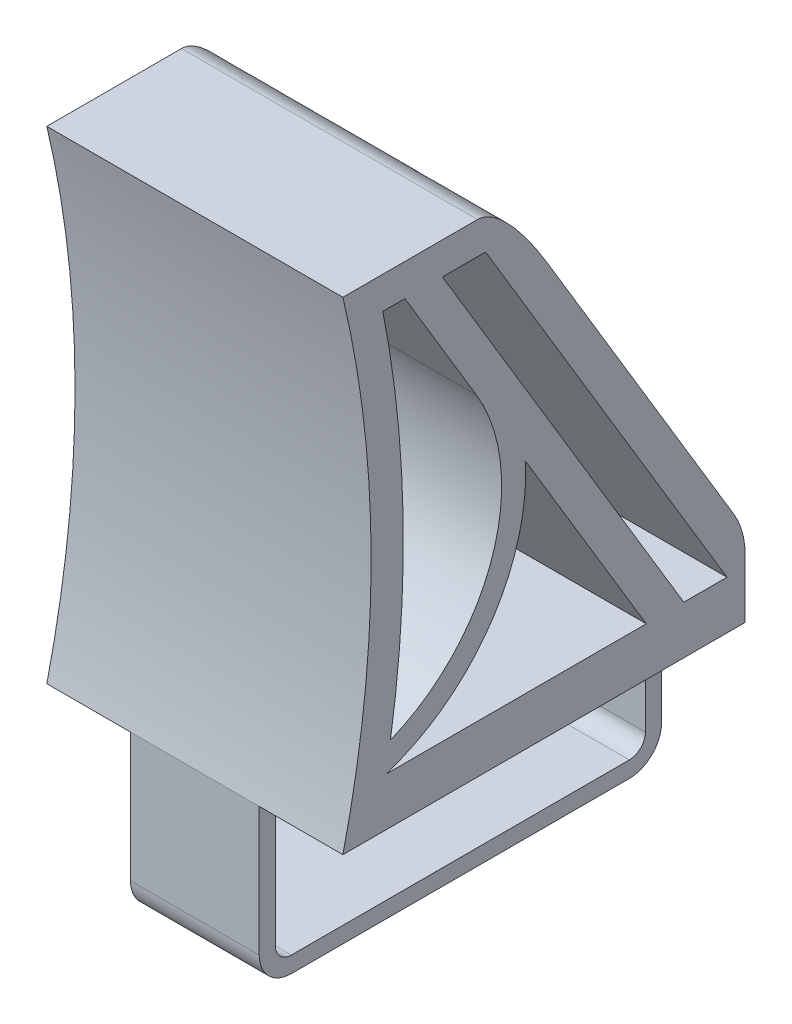
ISO-10303-21;
HEADER;
FILE_DESCRIPTION(('STEP AP214'),'2;1');
FILE_NAME('part.step','',(''),(''),'','','');
FILE_SCHEMA(('AUTOMOTIVE_DESIGN { 1 0 10303 214 1 1 1 1 }'));
ENDSEC;
DATA;
#1=APPLICATION_CONTEXT('core data for automotive mechanical design processes');
#2=APPLICATION_PROTOCOL_DEFINITION('international standard','automotive_design',2000,#1);
#3=PRODUCT_CONTEXT('',#1,'mechanical');
#4=PRODUCT('Part','Part','',(#3));
#5=PRODUCT_RELATED_PRODUCT_CATEGORY('part','',(#4));
#6=PRODUCT_DEFINITION_FORMATION('','',#4);
#7=PRODUCT_DEFINITION_CONTEXT('part definition',#1,'design');
#8=PRODUCT_DEFINITION('design','',#6,#7);
#9=PRODUCT_DEFINITION_SHAPE('','',#8);
#10=(LENGTH_UNIT() NAMED_UNIT(*) SI_UNIT(.MILLI.,.METRE.));
#11=(NAMED_UNIT(*) PLANE_ANGLE_UNIT() SI_UNIT($,.RADIAN.));
#12=(NAMED_UNIT(*) SI_UNIT($,.STERADIAN.) SOLID_ANGLE_UNIT());
#13=UNCERTAINTY_MEASURE_WITH_UNIT(LENGTH_MEASURE(1.E-05),#10,'distance_accuracy_value','');
#14=(GEOMETRIC_REPRESENTATION_CONTEXT(3) GLOBAL_UNCERTAINTY_ASSIGNED_CONTEXT((#13)) GLOBAL_UNIT_ASSIGNED_CONTEXT((#10,
#11,#12)) REPRESENTATION_CONTEXT('',''));
#15=CARTESIAN_POINT('',(0.,0.,0.));
#16=DIRECTION('',(0.,0.,1.));
#17=DIRECTION('',(1.,0.,0.));
#18=AXIS2_PLACEMENT_3D('',#15,#16,#17);
#19=CARTESIAN_POINT('',(5.2,0.,0.));
#20=DIRECTION('',(-1.,0.,0.));
#21=DIRECTION('',(0.,0.,-1.));
#22=AXIS2_PLACEMENT_3D('',#19,#20,#21);
#23=PLANE('',#22);
#24=DIRECTION('',(0.,0.,1.));
#25=VECTOR('',#24,1.);
#26=CARTESIAN_POINT('',(5.2,0.,0.));
#27=LINE('',#26,#25);
#28=CARTESIAN_POINT('',(5.20000000000001,0.,-25.));
#29=VERTEX_POINT('',#28);
#30=CARTESIAN_POINT('',(5.2,0.,0.));
#31=VERTEX_POINT('',#30);
#32=EDGE_CURVE('E718',#29,#31,#27,.T.);
#33=ORIENTED_EDGE('',*,*,#32,.F.);
#34=DIRECTION('',(0.,1.,0.));
#35=VECTOR('',#34,1.);
#36=CARTESIAN_POINT('',(5.20000000000001,0.,-25.));
#37=LINE('',#36,#35);
#38=CARTESIAN_POINT('',(5.20000000000001,-8.,-25.));
#39=VERTEX_POINT('',#38);
#40=EDGE_CURVE('E725',#39,#29,#37,.T.);
#41=ORIENTED_EDGE('',*,*,#40,.F.);
#42=CARTESIAN_POINT('',(5.20000000000001,-8.,-23.));
#43=DIRECTION('',(1.,0.,0.));
#44=DIRECTION('',(0.,0.,-1.));
#45=AXIS2_PLACEMENT_3D('',#42,#43,#44);
#46=CIRCLE('',#45,2.);
#47=CARTESIAN_POINT('',(5.20000000000001,-10.,-23.));
#48=VERTEX_POINT('',#47);
#49=EDGE_CURVE('E729',#48,#39,#46,.T.);
#50=ORIENTED_EDGE('',*,*,#49,.F.);
#51=DIRECTION('',(0.,0.,-1.));
#52=VECTOR('',#51,1.);
#53=CARTESIAN_POINT('',(5.2,-10.,0.));
#54=LINE('',#53,#52);
#55=CARTESIAN_POINT('',(5.2,-10.,-2.));
#56=VERTEX_POINT('',#55);
#57=EDGE_CURVE('E735',#56,#48,#54,.T.);
#58=ORIENTED_EDGE('',*,*,#57,.F.);
#59=CARTESIAN_POINT('',(5.2,-8.,-2.));
#60=DIRECTION('',(1.,0.,0.));
#61=DIRECTION('',(0.,0.,-1.));
#62=AXIS2_PLACEMENT_3D('',#59,#60,#61);
#63=CIRCLE('',#62,2.);
#64=CARTESIAN_POINT('',(5.2,-8.,0.));
#65=VERTEX_POINT('',#64);
#66=EDGE_CURVE('E720',#65,#56,#63,.T.);
#67=ORIENTED_EDGE('',*,*,#66,.F.);
#68=DIRECTION('',(0.,-1.,0.));
#69=VECTOR('',#68,1.);
#70=CARTESIAN_POINT('',(5.2,0.,0.));
#71=LINE('',#70,#69);
#72=EDGE_CURVE('E318',#31,#65,#71,.T.);
#73=ORIENTED_EDGE('',*,*,#72,.F.);
#74=EDGE_LOOP('',(#33,#41,#50,#58,#67,#73));
#75=FACE_BOUND('',#74,.T.);
#76=DIRECTION('',(0.,1.,0.));
#77=VECTOR('',#76,1.);
#78=CARTESIAN_POINT('',(5.20000000000001,0.,-24.));
#79=LINE('',#78,#77);
#80=CARTESIAN_POINT('',(5.20000000000001,-8.,-24.));
#81=VERTEX_POINT('',#80);
#82=CARTESIAN_POINT('',(5.20000000000001,-1.,-24.));
#83=VERTEX_POINT('',#82);
#84=EDGE_CURVE('E267',#81,#83,#79,.T.);
#85=ORIENTED_EDGE('',*,*,#84,.T.);
#86=DIRECTION('',(0.,0.,1.));
#87=VECTOR('',#86,1.);
#88=CARTESIAN_POINT('',(5.2,-1.,0.));
#89=LINE('',#88,#87);
#90=CARTESIAN_POINT('',(5.2,-1.,-0.999999999999996));
#91=VERTEX_POINT('',#90);
#92=EDGE_CURVE('E12',#83,#91,#89,.T.);
#93=ORIENTED_EDGE('',*,*,#92,.T.);
#94=DIRECTION('',(0.,-1.,0.));
#95=VECTOR('',#94,1.);
#96=CARTESIAN_POINT('',(5.2,0.,-0.999999999999996));
#97=LINE('',#96,#95);
#98=CARTESIAN_POINT('',(5.2,-8.,-0.999999999999996));
#99=VERTEX_POINT('',#98);
#100=EDGE_CURVE('E64',#91,#99,#97,.T.);
#101=ORIENTED_EDGE('',*,*,#100,.T.);
#102=CARTESIAN_POINT('',(5.2,-8.,-2.));
#103=DIRECTION('',(-1.,0.,0.));
#104=DIRECTION('',(0.,0.,1.));
#105=AXIS2_PLACEMENT_3D('',#102,#103,#104);
#106=CIRCLE('',#105,1.);
#107=CARTESIAN_POINT('',(5.20000000000001,-9.,-2.));
#108=VERTEX_POINT('',#107);
#109=EDGE_CURVE('E282',#99,#108,#106,.F.);
#110=ORIENTED_EDGE('',*,*,#109,.T.);
#111=DIRECTION('',(0.,0.,-1.));
#112=VECTOR('',#111,1.);
#113=CARTESIAN_POINT('',(5.2,-9.,0.));
#114=LINE('',#113,#112);
#115=CARTESIAN_POINT('',(5.20000000000001,-9.,-23.));
#116=VERTEX_POINT('',#115);
#117=EDGE_CURVE('E275',#108,#116,#114,.T.);
#118=ORIENTED_EDGE('',*,*,#117,.T.);
#119=CARTESIAN_POINT('',(5.20000000000001,-8.,-23.));
#120=DIRECTION('',(-1.,0.,0.));
#121=DIRECTION('',(0.,0.,1.));
#122=AXIS2_PLACEMENT_3D('',#119,#120,#121);
#123=CIRCLE('',#122,1.);
#124=EDGE_CURVE('E258',#116,#81,#123,.F.);
#125=ORIENTED_EDGE('',*,*,#124,.T.);
#126=EDGE_LOOP('',(#85,#93,#101,#110,#118,#125));
#127=FACE_BOUND('',#126,.T.);
#128=ADVANCED_FACE('F55',(#75,#127),#23,.T.);
#129=CARTESIAN_POINT('',(3.19999999999999,-10.,0.));
#130=DIRECTION('',(0.,0.,-1.));
#131=DIRECTION('',(-1.,0.,0.));
#132=AXIS2_PLACEMENT_3D('',#129,#130,#131);
#133=PLANE('',#132);
#134=ORIENTED_EDGE('',*,*,#72,.T.);
#135=DIRECTION('',(-1.,0.,0.));
#136=VECTOR('',#135,1.);
#137=CARTESIAN_POINT('',(15.2,-8.,0.));
#138=LINE('',#137,#136);
#139=CARTESIAN_POINT('',(13.2,-8.,0.));
#140=VERTEX_POINT('',#139);
#141=EDGE_CURVE('E673',#65,#140,#138,.F.);
#142=ORIENTED_EDGE('',*,*,#141,.T.);
#143=DIRECTION('',(0.,-1.,0.));
#144=VECTOR('',#143,1.);
#145=CARTESIAN_POINT('',(13.2,0.,0.));
#146=LINE('',#145,#144);
#147=CARTESIAN_POINT('',(13.2,0.,0.));
#148=VERTEX_POINT('',#147);
#149=EDGE_CURVE('E323',#148,#140,#146,.T.);
#150=ORIENTED_EDGE('',*,*,#149,.F.);
#151=DIRECTION('',(-1.,0.,0.));
#152=VECTOR('',#151,1.);
#153=CARTESIAN_POINT('',(3.19999999999999,0.,0.));
#154=LINE('',#153,#152);
#155=EDGE_CURVE('E340',#148,#31,#154,.T.);
#156=ORIENTED_EDGE('',*,*,#155,.T.);
#157=EDGE_LOOP('',(#134,#142,#150,#156));
#158=FACE_BOUND('',#157,.T.);
#159=ADVANCED_FACE('F706',(#158),#133,.F.);
#160=CARTESIAN_POINT('',(0.,-10.,0.));
#161=DIRECTION('',(0.,-1.,0.));
#162=DIRECTION('',(0.,0.,-1.));
#163=AXIS2_PLACEMENT_3D('',#160,#161,#162);
#164=PLANE('',#163);
#165=DIRECTION('',(-1.,0.,0.));
#166=VECTOR('',#165,1.);
#167=CARTESIAN_POINT('',(3.19999999999999,-10.,-2.));
#168=LINE('',#167,#166);
#169=CARTESIAN_POINT('',(13.2,-10.,-2.));
#170=VERTEX_POINT('',#169);
#171=EDGE_CURVE('E669',#170,#56,#168,.T.);
#172=ORIENTED_EDGE('',*,*,#171,.T.);
#173=ORIENTED_EDGE('',*,*,#57,.T.);
#174=DIRECTION('',(1.,0.,0.));
#175=VECTOR('',#174,1.);
#176=CARTESIAN_POINT('',(15.2,-10.,-23.));
#177=LINE('',#176,#175);
#178=CARTESIAN_POINT('',(13.2,-10.,-23.));
#179=VERTEX_POINT('',#178);
#180=EDGE_CURVE('E661',#48,#179,#177,.T.);
#181=ORIENTED_EDGE('',*,*,#180,.T.);
#182=DIRECTION('',(0.,0.,-1.));
#183=VECTOR('',#182,1.);
#184=CARTESIAN_POINT('',(13.2,-10.,0.));
#185=LINE('',#184,#183);
#186=EDGE_CURVE('E330',#170,#179,#185,.T.);
#187=ORIENTED_EDGE('',*,*,#186,.F.);
#188=EDGE_LOOP('',(#172,#173,#181,#187));
#189=FACE_BOUND('',#188,.T.);
#190=ADVANCED_FACE('F857',(#189),#164,.T.);
#191=CARTESIAN_POINT('',(0.,-8.,-2.));
#192=DIRECTION('',(1.,0.,0.));
#193=DIRECTION('',(0.,0.,-1.));
#194=AXIS2_PLACEMENT_3D('',#191,#192,#193);
#195=CYLINDRICAL_SURFACE('',#194,2.);
#196=ORIENTED_EDGE('',*,*,#141,.F.);
#197=ORIENTED_EDGE('',*,*,#66,.T.);
#198=ORIENTED_EDGE('',*,*,#171,.F.);
#199=CARTESIAN_POINT('',(13.2,-8.,-2.));
#200=DIRECTION('',(1.,0.,0.));
#201=DIRECTION('',(0.,0.,-1.));
#202=AXIS2_PLACEMENT_3D('',#199,#200,#201);
#203=CIRCLE('',#202,2.);
#204=EDGE_CURVE('E327',#140,#170,#203,.T.);
#205=ORIENTED_EDGE('',*,*,#204,.F.);
#206=EDGE_LOOP('',(#196,#197,#198,#205));
#207=FACE_BOUND('',#206,.T.);
#208=ADVANCED_FACE('F873',(#207),#195,.T.);
#209=CARTESIAN_POINT('',(0.,-8.,-23.));
#210=DIRECTION('',(-1.,0.,0.));
#211=DIRECTION('',(0.,0.,1.));
#212=AXIS2_PLACEMENT_3D('',#209,#210,#211);
#213=CYLINDRICAL_SURFACE('',#212,2.);
#214=ORIENTED_EDGE('',*,*,#180,.F.);
#215=ORIENTED_EDGE('',*,*,#49,.T.);
#216=DIRECTION('',(1.,0.,0.));
#217=VECTOR('',#216,1.);
#218=CARTESIAN_POINT('',(3.20000000000001,-8.,-25.));
#219=LINE('',#218,#217);
#220=CARTESIAN_POINT('',(13.2,-8.,-25.));
#221=VERTEX_POINT('',#220);
#222=EDGE_CURVE('E676',#221,#39,#219,.F.);
#223=ORIENTED_EDGE('',*,*,#222,.F.);
#224=CARTESIAN_POINT('',(13.2,-8.,-23.));
#225=DIRECTION('',(1.,0.,0.));
#226=DIRECTION('',(0.,0.,-1.));
#227=AXIS2_PLACEMENT_3D('',#224,#225,#226);
#228=CIRCLE('',#227,2.);
#229=EDGE_CURVE('E333',#179,#221,#228,.T.);
#230=ORIENTED_EDGE('',*,*,#229,.F.);
#231=EDGE_LOOP('',(#214,#215,#223,#230));
#232=FACE_BOUND('',#231,.T.);
#233=ADVANCED_FACE('F57',(#232),#213,.T.);
#234=CARTESIAN_POINT('',(18.4,0.,-25.));
#235=DIRECTION('',(0.,0.,1.));
#236=DIRECTION('',(1.,0.,0.));
#237=AXIS2_PLACEMENT_3D('',#234,#235,#236);
#238=PLANE('',#237);
#239=ORIENTED_EDGE('',*,*,#40,.T.);
#240=DIRECTION('',(-1.,0.,0.));
#241=VECTOR('',#240,1.);
#242=CARTESIAN_POINT('',(18.4,0.,-25.));
#243=LINE('',#242,#241);
#244=CARTESIAN_POINT('',(0.,0.,-25.));
#245=VERTEX_POINT('',#244);
#246=EDGE_CURVE('E534',#29,#245,#243,.T.);
#247=ORIENTED_EDGE('',*,*,#246,.T.);
#248=DIRECTION('',(0.,1.,0.));
#249=VECTOR('',#248,1.);
#250=CARTESIAN_POINT('',(0.,0.,-25.));
#251=LINE('',#250,#249);
#252=CARTESIAN_POINT('',(0.,3.61508017525783,-25.));
#253=VERTEX_POINT('',#252);
#254=EDGE_CURVE('E522',#245,#253,#251,.T.);
#255=ORIENTED_EDGE('',*,*,#254,.T.);
#256=DIRECTION('',(-1.,0.,0.));
#257=VECTOR('',#256,1.);
#258=CARTESIAN_POINT('',(18.4,3.61508017525783,-25.));
#259=LINE('',#258,#257);
#260=CARTESIAN_POINT('',(18.4,3.61508017525783,-25.));
#261=VERTEX_POINT('',#260);
#262=EDGE_CURVE('E647',#253,#261,#259,.F.);
#263=ORIENTED_EDGE('',*,*,#262,.T.);
#264=DIRECTION('',(0.,1.,0.));
#265=VECTOR('',#264,1.);
#266=CARTESIAN_POINT('',(18.4,0.,-25.));
#267=LINE('',#266,#265);
#268=CARTESIAN_POINT('',(18.4,0.,-25.));
#269=VERTEX_POINT('',#268);
#270=EDGE_CURVE('E808',#269,#261,#267,.T.);
#271=ORIENTED_EDGE('',*,*,#270,.F.);
#272=CARTESIAN_POINT('',(13.2,0.,-25.));
#273=VERTEX_POINT('',#272);
#274=EDGE_CURVE('E530',#269,#273,#243,.T.);
#275=ORIENTED_EDGE('',*,*,#274,.T.);
#276=DIRECTION('',(0.,1.,0.));
#277=VECTOR('',#276,1.);
#278=CARTESIAN_POINT('',(13.2,0.,-25.));
#279=LINE('',#278,#277);
#280=EDGE_CURVE('E336',#221,#273,#279,.T.);
#281=ORIENTED_EDGE('',*,*,#280,.F.);
#282=ORIENTED_EDGE('',*,*,#222,.T.);
#283=EDGE_LOOP('',(#239,#247,#255,#263,#271,#275,#281,#282));
#284=FACE_BOUND('',#283,.T.);
#285=ADVANCED_FACE('F645',(#284),#238,.F.);
#286=CARTESIAN_POINT('',(18.4,0.,0.));
#287=DIRECTION('',(0.,1.,0.));
#288=DIRECTION('',(0.,0.,1.));
#289=AXIS2_PLACEMENT_3D('',#286,#287,#288);
#290=PLANE('',#289);
#291=ORIENTED_EDGE('',*,*,#246,.F.);
#292=ORIENTED_EDGE('',*,*,#32,.T.);
#293=DIRECTION('',(-1.,0.,0.));
#294=VECTOR('',#293,1.);
#295=CARTESIAN_POINT('',(18.4,0.,0.));
#296=LINE('',#295,#294);
#297=CARTESIAN_POINT('',(0.,0.,0.));
#298=VERTEX_POINT('',#297);
#299=EDGE_CURVE('E533',#31,#298,#296,.T.);
#300=ORIENTED_EDGE('',*,*,#299,.T.);
#301=DIRECTION('',(0.,0.,-1.));
#302=VECTOR('',#301,1.);
#303=CARTESIAN_POINT('',(0.,0.,0.));
#304=LINE('',#303,#302);
#305=EDGE_CURVE('E632',#298,#245,#304,.T.);
#306=ORIENTED_EDGE('',*,*,#305,.T.);
#307=EDGE_LOOP('',(#291,#292,#300,#306));
#308=FACE_BOUND('',#307,.T.);
#309=ADVANCED_FACE('F723',(#308),#290,.F.);
#310=CARTESIAN_POINT('',(18.4,0.,0.));
#311=VERTEX_POINT('',#310);
#312=EDGE_CURVE('E535',#311,#148,#296,.T.);
#313=ORIENTED_EDGE('',*,*,#312,.T.);
#314=DIRECTION('',(0.,0.,1.));
#315=VECTOR('',#314,1.);
#316=CARTESIAN_POINT('',(13.2,0.,0.));
#317=LINE('',#316,#315);
#318=EDGE_CURVE('E319',#273,#148,#317,.T.);
#319=ORIENTED_EDGE('',*,*,#318,.F.);
#320=ORIENTED_EDGE('',*,*,#274,.F.);
#321=DIRECTION('',(0.,0.,-1.));
#322=VECTOR('',#321,1.);
#323=CARTESIAN_POINT('',(18.4,0.,0.));
#324=LINE('',#323,#322);
#325=EDGE_CURVE('E817',#311,#269,#324,.T.);
#326=ORIENTED_EDGE('',*,*,#325,.F.);
#327=EDGE_LOOP('',(#313,#319,#320,#326));
#328=FACE_BOUND('',#327,.T.);
#329=ADVANCED_FACE('F418',(#328),#290,.F.);
#330=CARTESIAN_POINT('',(18.4,30.,0.));
#331=DIRECTION('',(0.,-1.,0.));
#332=DIRECTION('',(0.,0.,-1.));
#333=AXIS2_PLACEMENT_3D('',#330,#331,#332);
#334=PLANE('',#333);
#335=DIRECTION('',(0.,0.,1.));
#336=VECTOR('',#335,1.);
#337=CARTESIAN_POINT('',(18.4,30.,0.));
#338=LINE('',#337,#336);
#339=CARTESIAN_POINT('',(18.4,30.,-8.36904810515469));
#340=VERTEX_POINT('',#339);
#341=CARTESIAN_POINT('',(18.4,30.,0.));
#342=VERTEX_POINT('',#341);
#343=EDGE_CURVE('E382',#340,#342,#338,.T.);
#344=ORIENTED_EDGE('',*,*,#343,.F.);
#345=CARTESIAN_POINT('',(-0.920000000000004,30.,-8.36904810515469));
#346=CARTESIAN_POINT('',(5.82666666666666,30.,-8.36904810515469));
#347=CARTESIAN_POINT('',(12.5733333333333,30.,-8.36904810515469));
#348=CARTESIAN_POINT('',(19.32,30.,-8.36904810515469));
#349=(BOUNDED_CURVE() B_SPLINE_CURVE(3,(#345,#346,#347,#348),.UNSPECIFIED.,.F.,
.F.) B_SPLINE_CURVE_WITH_KNOTS((4,4),(-0.000920000000000001,0.01932),
.UNSPECIFIED.) CURVE() GEOMETRIC_REPRESENTATION_ITEM() RATIONAL_B_SPLINE_CURVE((1.,1.,1.,1.)) REPRESENTATION_ITEM(''));
#350=CARTESIAN_POINT('',(0.,30.,-8.36904810515469));
#351=VERTEX_POINT('',#350);
#352=EDGE_CURVE('E399',#340,#351,#349,.F.);
#353=ORIENTED_EDGE('',*,*,#352,.T.);
#354=DIRECTION('',(0.,0.,1.));
#355=VECTOR('',#354,1.);
#356=CARTESIAN_POINT('',(0.,30.,0.));
#357=LINE('',#356,#355);
#358=CARTESIAN_POINT('',(0.,30.,0.));
#359=VERTEX_POINT('',#358);
#360=EDGE_CURVE('E391',#351,#359,#357,.T.);
#361=ORIENTED_EDGE('',*,*,#360,.T.);
#362=DIRECTION('',(-1.,0.,0.));
#363=VECTOR('',#362,1.);
#364=CARTESIAN_POINT('',(18.4,30.,0.));
#365=LINE('',#364,#363);
#366=EDGE_CURVE('E538',#342,#359,#365,.T.);
#367=ORIENTED_EDGE('',*,*,#366,.F.);
#368=EDGE_LOOP('',(#344,#353,#361,#367));
#369=FACE_BOUND('',#368,.T.);
#370=ADVANCED_FACE('F407',(#369),#334,.F.);
#371=CARTESIAN_POINT('',(18.4,15.,63.2455532033676));
#372=DIRECTION('',(-1.,0.,0.));
#373=DIRECTION('',(0.,0.,1.));
#374=AXIS2_PLACEMENT_3D('',#371,#372,#373);
#375=CYLINDRICAL_SURFACE('',#374,65.);
#376=CARTESIAN_POINT('',(0.,15.,63.2455532033676));
#377=DIRECTION('',(1.,0.,0.));
#378=DIRECTION('',(0.,0.,-1.));
#379=AXIS2_PLACEMENT_3D('',#376,#377,#378);
#380=CIRCLE('',#379,65.);
#381=EDGE_CURVE('E629',#359,#298,#380,.F.);
#382=ORIENTED_EDGE('',*,*,#381,.T.);
#383=ORIENTED_EDGE('',*,*,#299,.F.);
#384=ORIENTED_EDGE('',*,*,#155,.F.);
#385=ORIENTED_EDGE('',*,*,#312,.F.);
#386=CARTESIAN_POINT('',(18.4,15.,63.2455532033676));
#387=DIRECTION('',(1.,0.,0.));
#388=DIRECTION('',(0.,0.,-1.));
#389=AXIS2_PLACEMENT_3D('',#386,#387,#388);
#390=CIRCLE('',#389,65.);
#391=EDGE_CURVE('E385',#342,#311,#390,.F.);
#392=ORIENTED_EDGE('',*,*,#391,.F.);
#393=ORIENTED_EDGE('',*,*,#366,.T.);
#394=EDGE_LOOP('',(#382,#383,#384,#385,#392,#393));
#395=FACE_BOUND('',#394,.T.);
#396=ADVANCED_FACE('F417',(#395),#375,.F.);
#397=CARTESIAN_POINT('',(18.4,2.99999999999999,0.));
#398=DIRECTION('',(0.,1.,0.));
#399=DIRECTION('',(0.,0.,1.));
#400=AXIS2_PLACEMENT_3D('',#397,#398,#399);
#401=PLANE('',#400);
#402=DIRECTION('',(0.,0.,-1.));
#403=VECTOR('',#402,1.);
#404=CARTESIAN_POINT('',(0.,2.99999999999999,0.));
#405=LINE('',#404,#403);
#406=CARTESIAN_POINT('',(0.,3.,-21.185381370433));
#407=VERTEX_POINT('',#406);
#408=CARTESIAN_POINT('',(0.,3.,-23.8676192420619));
#409=VERTEX_POINT('',#408);
#410=EDGE_CURVE('E612',#407,#409,#405,.T.);
#411=ORIENTED_EDGE('',*,*,#410,.F.);
#412=DIRECTION('',(-1.,0.,0.));
#413=VECTOR('',#412,1.);
#414=CARTESIAN_POINT('',(18.4,3.,-21.185381370433));
#415=LINE('',#414,#413);
#416=CARTESIAN_POINT('',(18.4,3.,-21.185381370433));
#417=VERTEX_POINT('',#416);
#418=EDGE_CURVE('E552',#417,#407,#415,.T.);
#419=ORIENTED_EDGE('',*,*,#418,.F.);
#420=DIRECTION('',(0.,0.,-1.));
#421=VECTOR('',#420,1.);
#422=CARTESIAN_POINT('',(18.4,2.99999999999999,0.));
#423=LINE('',#422,#421);
#424=CARTESIAN_POINT('',(18.4,3.,-23.8676192420619));
#425=VERTEX_POINT('',#424);
#426=EDGE_CURVE('E368',#417,#425,#423,.T.);
#427=ORIENTED_EDGE('',*,*,#426,.T.);
#428=DIRECTION('',(-1.,0.,0.));
#429=VECTOR('',#428,1.);
#430=CARTESIAN_POINT('',(18.4,3.,-23.8676192420619));
#431=LINE('',#430,#429);
#432=EDGE_CURVE('E542',#425,#409,#431,.T.);
#433=ORIENTED_EDGE('',*,*,#432,.T.);
#434=EDGE_LOOP('',(#411,#419,#427,#433));
#435=FACE_BOUND('',#434,.T.);
#436=ADVANCED_FACE('F434',(#435),#401,.T.);
#437=CARTESIAN_POINT('',(18.4,10.1406094281322,-16.9010157135537));
#438=DIRECTION('',(0.,-0.514495755427526,0.857492925712544));
#439=DIRECTION('',(0.,-0.857492925712544,-0.514495755427526));
#440=AXIS2_PLACEMENT_3D('',#437,#438,#439);
#441=PLANE('',#440);
#442=DIRECTION('',(0.,0.857492925712544,0.514495755427526));
#443=VECTOR('',#442,1.);
#444=CARTESIAN_POINT('',(0.,10.1406094281322,-16.9010157135537));
#445=LINE('',#444,#443);
#446=CARTESIAN_POINT('',(0.,28.,-6.18538137043304));
#447=VERTEX_POINT('',#446);
#448=EDGE_CURVE('E616',#407,#447,#445,.T.);
#449=ORIENTED_EDGE('',*,*,#448,.T.);
#450=DIRECTION('',(-1.,0.,0.));
#451=VECTOR('',#450,1.);
#452=CARTESIAN_POINT('',(18.4,28.,-6.18538137043304));
#453=LINE('',#452,#451);
#454=CARTESIAN_POINT('',(18.4,28.,-6.18538137043304));
#455=VERTEX_POINT('',#454);
#456=EDGE_CURVE('E549',#455,#447,#453,.T.);
#457=ORIENTED_EDGE('',*,*,#456,.F.);
#458=DIRECTION('',(0.,0.857492925712544,0.514495755427526));
#459=VECTOR('',#458,1.);
#460=CARTESIAN_POINT('',(18.4,10.1406094281322,-16.9010157135537));
#461=LINE('',#460,#459);
#462=EDGE_CURVE('E372',#417,#455,#461,.T.);
#463=ORIENTED_EDGE('',*,*,#462,.F.);
#464=ORIENTED_EDGE('',*,*,#418,.T.);
#465=EDGE_LOOP('',(#449,#457,#463,#464));
#466=FACE_BOUND('',#465,.T.);
#467=ADVANCED_FACE('F430',(#466),#441,.F.);
#468=CARTESIAN_POINT('',(18.4,28.,0.));
#469=DIRECTION('',(0.,-1.,0.));
#470=DIRECTION('',(0.,0.,-1.));
#471=AXIS2_PLACEMENT_3D('',#468,#469,#470);
#472=PLANE('',#471);
#473=DIRECTION('',(0.,0.,1.));
#474=VECTOR('',#473,1.);
#475=CARTESIAN_POINT('',(0.,28.,0.));
#476=LINE('',#475,#474);
#477=CARTESIAN_POINT('',(0.,28.,-8.86761924206188));
#478=VERTEX_POINT('',#477);
#479=EDGE_CURVE('E620',#478,#447,#476,.T.);
#480=ORIENTED_EDGE('',*,*,#479,.F.);
#481=DIRECTION('',(-1.,0.,0.));
#482=VECTOR('',#481,1.);
#483=CARTESIAN_POINT('',(18.4,28.,-8.86761924206188));
#484=LINE('',#483,#482);
#485=CARTESIAN_POINT('',(18.4,28.,-8.86761924206188));
#486=VERTEX_POINT('',#485);
#487=EDGE_CURVE('E545',#486,#478,#484,.T.);
#488=ORIENTED_EDGE('',*,*,#487,.F.);
#489=DIRECTION('',(0.,0.,1.));
#490=VECTOR('',#489,1.);
#491=CARTESIAN_POINT('',(18.4,28.,0.));
#492=LINE('',#491,#490);
#493=EDGE_CURVE('E375',#486,#455,#492,.T.);
#494=ORIENTED_EDGE('',*,*,#493,.T.);
#495=ORIENTED_EDGE('',*,*,#456,.T.);
#496=EDGE_LOOP('',(#480,#488,#494,#495));
#497=FACE_BOUND('',#496,.T.);
#498=ADVANCED_FACE('F426',(#497),#472,.T.);
#499=CARTESIAN_POINT('',(18.4,15.,63.2455532033676));
#500=DIRECTION('',(-1.,0.,0.));
#501=DIRECTION('',(0.,0.,1.));
#502=AXIS2_PLACEMENT_3D('',#499,#500,#501);
#503=CYLINDRICAL_SURFACE('',#502,67.);
#504=CARTESIAN_POINT('',(0.,15.,63.2455532033676));
#505=DIRECTION('',(1.,0.,0.));
#506=DIRECTION('',(0.,0.,-1.));
#507=AXIS2_PLACEMENT_3D('',#504,#505,#506);
#508=CIRCLE('',#507,67.);
#509=CARTESIAN_POINT('',(0.,28.,-2.48115369725235));
#510=VERTEX_POINT('',#509);
#511=CARTESIAN_POINT('',(0.,4.69733108987312,-2.9575812641809));
#512=VERTEX_POINT('',#511);
#513=EDGE_CURVE('E597',#510,#512,#508,.F.);
#514=ORIENTED_EDGE('',*,*,#513,.F.);
#515=DIRECTION('',(-1.,0.,0.));
#516=VECTOR('',#515,1.);
#517=CARTESIAN_POINT('',(18.4,28.,-2.48115369725235));
#518=LINE('',#517,#516);
#519=CARTESIAN_POINT('',(18.4,28.,-2.48115369725235));
#520=VERTEX_POINT('',#519);
#521=EDGE_CURVE('E546',#520,#510,#518,.T.);
#522=ORIENTED_EDGE('',*,*,#521,.F.);
#523=CARTESIAN_POINT('',(18.4,15.,63.2455532033676));
#524=DIRECTION('',(1.,0.,0.));
#525=DIRECTION('',(0.,0.,-1.));
#526=AXIS2_PLACEMENT_3D('',#523,#524,#525);
#527=CIRCLE('',#526,67.);
#528=CARTESIAN_POINT('',(18.4,4.69733108987312,-2.9575812641809));
#529=VERTEX_POINT('',#528);
#530=EDGE_CURVE('E356',#520,#529,#527,.F.);
#531=ORIENTED_EDGE('',*,*,#530,.T.);
#532=DIRECTION('',(-1.,0.,0.));
#533=VECTOR('',#532,1.);
#534=CARTESIAN_POINT('',(18.4,4.69733108987312,-2.9575812641809));
#535=LINE('',#534,#533);
#536=EDGE_CURVE('E555',#529,#512,#535,.T.);
#537=ORIENTED_EDGE('',*,*,#536,.T.);
#538=EDGE_LOOP('',(#514,#522,#531,#537));
#539=FACE_BOUND('',#538,.T.);
#540=ADVANCED_FACE('F429',(#539),#503,.T.);
#541=CARTESIAN_POINT('',(18.4,28.,0.));
#542=DIRECTION('',(0.,-1.,0.));
#543=DIRECTION('',(0.,0.,-1.));
#544=AXIS2_PLACEMENT_3D('',#541,#542,#543);
#545=PLANE('',#544);
#546=DIRECTION('',(0.,0.,1.));
#547=VECTOR('',#546,1.);
#548=CARTESIAN_POINT('',(0.,28.,0.));
#549=LINE('',#548,#547);
#550=CARTESIAN_POINT('',(0.,28.,-3.85300061249492));
#551=VERTEX_POINT('',#550);
#552=EDGE_CURVE('E604',#551,#510,#549,.T.);
#553=ORIENTED_EDGE('',*,*,#552,.F.);
#554=DIRECTION('',(-1.,0.,0.));
#555=VECTOR('',#554,1.);
#556=CARTESIAN_POINT('',(18.4,28.,-3.85300061249492));
#557=LINE('',#556,#555);
#558=CARTESIAN_POINT('',(18.4,28.,-3.85300061249492));
#559=VERTEX_POINT('',#558);
#560=EDGE_CURVE('E563',#559,#551,#557,.T.);
#561=ORIENTED_EDGE('',*,*,#560,.F.);
#562=DIRECTION('',(0.,0.,1.));
#563=VECTOR('',#562,1.);
#564=CARTESIAN_POINT('',(18.4,28.,0.));
#565=LINE('',#564,#563);
#566=EDGE_CURVE('E361',#559,#520,#565,.T.);
#567=ORIENTED_EDGE('',*,*,#566,.T.);
#568=ORIENTED_EDGE('',*,*,#521,.T.);
#569=EDGE_LOOP('',(#553,#561,#567,#568));
#570=FACE_BOUND('',#569,.T.);
#571=ADVANCED_FACE('F447',(#570),#545,.T.);
#572=CARTESIAN_POINT('',(18.4,9.11161791727717,-15.1860298621286));
#573=DIRECTION('',(0.,0.514495755427526,-0.857492925712544));
#574=DIRECTION('',(0.,0.857492925712544,0.514495755427526));
#575=AXIS2_PLACEMENT_3D('',#572,#573,#574);
#576=PLANE('',#575);
#577=DIRECTION('',(0.,-0.857492925712544,-0.514495755427526));
#578=VECTOR('',#577,1.);
#579=CARTESIAN_POINT('',(0.,9.11161791727717,-15.1860298621286));
#580=LINE('',#579,#578);
#581=CARTESIAN_POINT('',(0.,20.5963011661332,-8.29521991281503));
#582=VERTEX_POINT('',#581);
#583=EDGE_CURVE('E599',#551,#582,#580,.T.);
#584=ORIENTED_EDGE('',*,*,#583,.T.);
#585=DIRECTION('',(-1.,0.,0.));
#586=VECTOR('',#585,1.);
#587=CARTESIAN_POINT('',(18.4,20.5963011661332,-8.29521991281503));
#588=LINE('',#587,#586);
#589=CARTESIAN_POINT('',(18.4,20.5963011661332,-8.29521991281503));
#590=VERTEX_POINT('',#589);
#591=EDGE_CURVE('E558',#590,#582,#588,.T.);
#592=ORIENTED_EDGE('',*,*,#591,.F.);
#593=DIRECTION('',(0.,-0.857492925712544,-0.514495755427526));
#594=VECTOR('',#593,1.);
#595=CARTESIAN_POINT('',(18.4,9.11161791727717,-15.1860298621286));
#596=LINE('',#595,#594);
#597=EDGE_CURVE('E357',#559,#590,#596,.T.);
#598=ORIENTED_EDGE('',*,*,#597,.F.);
#599=ORIENTED_EDGE('',*,*,#560,.T.);
#600=EDGE_LOOP('',(#584,#592,#598,#599));
#601=FACE_BOUND('',#600,.T.);
#602=ADVANCED_FACE('F443',(#601),#576,.F.);
#603=CARTESIAN_POINT('',(18.4,3.,0.));
#604=DIRECTION('',(0.,-1.,0.));
#605=DIRECTION('',(0.,0.,-1.));
#606=AXIS2_PLACEMENT_3D('',#603,#604,#605);
#607=PLANE('',#606);
#608=DIRECTION('',(0.,0.,1.));
#609=VECTOR('',#608,1.);
#610=CARTESIAN_POINT('',(0.,3.,0.));
#611=LINE('',#610,#609);
#612=CARTESIAN_POINT('',(0.,3.,-18.8530006124949));
#613=VERTEX_POINT('',#612);
#614=CARTESIAN_POINT('',(0.,3.,-2.67106078734041));
#615=VERTEX_POINT('',#614);
#616=EDGE_CURVE('E344',#613,#615,#611,.T.);
#617=ORIENTED_EDGE('',*,*,#616,.T.);
#618=DIRECTION('',(-1.,0.,0.));
#619=VECTOR('',#618,1.);
#620=CARTESIAN_POINT('',(18.4,3.,-2.67106078734041));
#621=LINE('',#620,#619);
#622=CARTESIAN_POINT('',(18.4,3.,-2.67106078734041));
#623=VERTEX_POINT('',#622);
#624=EDGE_CURVE('E559',#623,#615,#621,.T.);
#625=ORIENTED_EDGE('',*,*,#624,.F.);
#626=DIRECTION('',(0.,0.,1.));
#627=VECTOR('',#626,1.);
#628=CARTESIAN_POINT('',(18.4,3.,0.));
#629=LINE('',#628,#627);
#630=CARTESIAN_POINT('',(18.4,3.,-18.8530006124949));
#631=VERTEX_POINT('',#630);
#632=EDGE_CURVE('E345',#631,#623,#629,.T.);
#633=ORIENTED_EDGE('',*,*,#632,.F.);
#634=DIRECTION('',(-1.,0.,0.));
#635=VECTOR('',#634,1.);
#636=CARTESIAN_POINT('',(18.4,3.,-18.8530006124949));
#637=LINE('',#636,#635);
#638=EDGE_CURVE('E568',#631,#613,#637,.T.);
#639=ORIENTED_EDGE('',*,*,#638,.T.);
#640=EDGE_LOOP('',(#617,#625,#633,#639));
#641=FACE_BOUND('',#640,.T.);
#642=ADVANCED_FACE('F446',(#641),#607,.F.);
#643=CARTESIAN_POINT('',(18.4,14.9244470710065,1.15787024572942));
#644=DIRECTION('',(-1.,0.,0.));
#645=DIRECTION('',(0.,0.,1.));
#646=AXIS2_PLACEMENT_3D('',#643,#644,#645);
#647=CYLINDRICAL_SURFACE('',#646,12.5241027944217);
#648=CARTESIAN_POINT('',(0.,14.9244470710065,1.15787024572942));
#649=DIRECTION('',(1.,0.,0.));
#650=DIRECTION('',(0.,0.,-1.));
#651=AXIS2_PLACEMENT_3D('',#648,#649,#650);
#652=CIRCLE('',#651,12.5241027944217);
#653=CARTESIAN_POINT('',(0.,15.5,-11.3530006124949));
#654=VERTEX_POINT('',#653);
#655=EDGE_CURVE('E581',#654,#615,#652,.F.);
#656=ORIENTED_EDGE('',*,*,#655,.F.);
#657=DIRECTION('',(-1.,0.,0.));
#658=VECTOR('',#657,1.);
#659=CARTESIAN_POINT('',(18.4,15.5,-11.3530006124949));
#660=LINE('',#659,#658);
#661=CARTESIAN_POINT('',(18.4,15.5,-11.3530006124949));
#662=VERTEX_POINT('',#661);
#663=EDGE_CURVE('E572',#662,#654,#660,.T.);
#664=ORIENTED_EDGE('',*,*,#663,.F.);
#665=CARTESIAN_POINT('',(18.4,14.9244470710065,1.15787024572942));
#666=DIRECTION('',(1.,0.,0.));
#667=DIRECTION('',(0.,0.,-1.));
#668=AXIS2_PLACEMENT_3D('',#665,#666,#667);
#669=CIRCLE('',#668,12.5241027944217);
#670=EDGE_CURVE('E348',#662,#623,#669,.F.);
#671=ORIENTED_EDGE('',*,*,#670,.T.);
#672=ORIENTED_EDGE('',*,*,#624,.T.);
#673=EDGE_LOOP('',(#656,#664,#671,#672));
#674=FACE_BOUND('',#673,.T.);
#675=ADVANCED_FACE('F424',(#674),#647,.T.);
#676=CARTESIAN_POINT('',(18.4,11.3239496656155,-18.8732494426926));
#677=DIRECTION('',(0.,0.514495755427527,-0.857492925712544));
#678=DIRECTION('',(0.,0.857492925712544,0.514495755427527));
#679=AXIS2_PLACEMENT_3D('',#676,#677,#678);
#680=PLANE('',#679);
#681=DIRECTION('',(0.,-0.857492925712544,-0.514495755427527));
#682=VECTOR('',#681,1.);
#683=CARTESIAN_POINT('',(0.,11.3239496656155,-18.8732494426926));
#684=LINE('',#683,#682);
#685=EDGE_CURVE('E624',#478,#409,#684,.T.);
#686=ORIENTED_EDGE('',*,*,#685,.T.);
#687=ORIENTED_EDGE('',*,*,#432,.F.);
#688=DIRECTION('',(0.,-0.857492925712544,-0.514495755427527));
#689=VECTOR('',#688,1.);
#690=CARTESIAN_POINT('',(18.4,11.3239496656155,-18.8732494426926));
#691=LINE('',#690,#689);
#692=EDGE_CURVE('E379',#486,#425,#691,.T.);
#693=ORIENTED_EDGE('',*,*,#692,.F.);
#694=ORIENTED_EDGE('',*,*,#487,.T.);
#695=EDGE_LOOP('',(#686,#687,#693,#694));
#696=FACE_BOUND('',#695,.T.);
#697=ADVANCED_FACE('F420',(#696),#680,.F.);
#698=CARTESIAN_POINT('',(18.4,14.9244470710065,1.15787024572942));
#699=DIRECTION('',(-1.,0.,0.));
#700=DIRECTION('',(0.,0.,1.));
#701=AXIS2_PLACEMENT_3D('',#698,#699,#700);
#702=CYLINDRICAL_SURFACE('',#701,11.0241027944216);
#703=CARTESIAN_POINT('',(0.,14.9244470710065,1.15787024572942));
#704=DIRECTION('',(1.,0.,0.));
#705=DIRECTION('',(0.,0.,-1.));
#706=AXIS2_PLACEMENT_3D('',#703,#704,#705);
#707=CIRCLE('',#706,11.0241027944216);
#708=EDGE_CURVE('E608',#582,#512,#707,.F.);
#709=ORIENTED_EDGE('',*,*,#708,.T.);
#710=ORIENTED_EDGE('',*,*,#536,.F.);
#711=CARTESIAN_POINT('',(18.4,14.9244470710065,1.15787024572942));
#712=DIRECTION('',(1.,0.,0.));
#713=DIRECTION('',(0.,0.,-1.));
#714=AXIS2_PLACEMENT_3D('',#711,#712,#713);
#715=CIRCLE('',#714,11.0241027944216);
#716=EDGE_CURVE('E365',#590,#529,#715,.F.);
#717=ORIENTED_EDGE('',*,*,#716,.F.);
#718=ORIENTED_EDGE('',*,*,#591,.T.);
#719=EDGE_LOOP('',(#709,#710,#717,#718));
#720=FACE_BOUND('',#719,.T.);
#721=ADVANCED_FACE('F423',(#720),#702,.F.);
#722=EDGE_CURVE('E591',#654,#613,#580,.T.);
#723=ORIENTED_EDGE('',*,*,#722,.T.);
#724=ORIENTED_EDGE('',*,*,#638,.F.);
#725=EDGE_CURVE('E353',#662,#631,#596,.T.);
#726=ORIENTED_EDGE('',*,*,#725,.F.);
#727=ORIENTED_EDGE('',*,*,#663,.T.);
#728=EDGE_LOOP('',(#723,#724,#726,#727));
#729=FACE_BOUND('',#728,.T.);
#730=ADVANCED_FACE('F441',(#729),#576,.F.);
#731=CARTESIAN_POINT('',(18.4,12.3529411764706,-20.5882352941176));
#732=DIRECTION('',(0.,-0.514495755427527,0.857492925712544));
#733=DIRECTION('',(0.,-0.857492925712544,-0.514495755427527));
#734=AXIS2_PLACEMENT_3D('',#731,#732,#733);
#735=PLANE('',#734);
#736=DIRECTION('',(0.,0.857492925712544,0.514495755427527));
#737=VECTOR('',#736,1.);
#738=CARTESIAN_POINT('',(18.4,12.3529411764706,-20.5882352941176));
#739=LINE('',#738,#737);
#740=CARTESIAN_POINT('',(18.4,6.18755895239546,-24.2874646285627));
#741=VERTEX_POINT('',#740);
#742=CARTESIAN_POINT('',(18.4,25.5724787771376,-12.6565127337174));
#743=VERTEX_POINT('',#742);
#744=EDGE_CURVE('E523',#741,#743,#739,.T.);
#745=ORIENTED_EDGE('',*,*,#744,.F.);
#746=DIRECTION('',(-1.,0.,0.));
#747=VECTOR('',#746,1.);
#748=CARTESIAN_POINT('',(18.4,6.18755895239546,-24.2874646285627));
#749=LINE('',#748,#747);
#750=CARTESIAN_POINT('',(0.,6.18755895239546,-24.2874646285627));
#751=VERTEX_POINT('',#750);
#752=EDGE_CURVE('E664',#741,#751,#749,.T.);
#753=ORIENTED_EDGE('',*,*,#752,.T.);
#754=DIRECTION('',(0.,0.857492925712544,0.514495755427527));
#755=VECTOR('',#754,1.);
#756=CARTESIAN_POINT('',(0.,12.3529411764706,-20.5882352941176));
#757=LINE('',#756,#755);
#758=CARTESIAN_POINT('',(0.,25.5724787771376,-12.6565127337174));
#759=VERTEX_POINT('',#758);
#760=EDGE_CURVE('E349',#751,#759,#757,.T.);
#761=ORIENTED_EDGE('',*,*,#760,.T.);
#762=CARTESIAN_POINT('',(19.32,25.5724787771376,-12.6565127337174));
#763=CARTESIAN_POINT('',(12.5733333333333,25.5724787771376,-12.6565127337174));
#764=CARTESIAN_POINT('',(5.82666666666666,25.5724787771376,-12.6565127337174));
#765=CARTESIAN_POINT('',(-0.920000000000004,25.5724787771376,-12.6565127337174));
#766=(BOUNDED_CURVE() B_SPLINE_CURVE(3,(#762,#763,#764,#765),.UNSPECIFIED.,.F.,
.F.) B_SPLINE_CURVE_WITH_KNOTS((4,4),(-0.00092,0.01932),
.UNSPECIFIED.) CURVE() GEOMETRIC_REPRESENTATION_ITEM() RATIONAL_B_SPLINE_CURVE((1.,1.,1.,1.)) REPRESENTATION_ITEM(''));
#767=EDGE_CURVE('E759',#759,#743,#766,.F.);
#768=ORIENTED_EDGE('',*,*,#767,.T.);
#769=EDGE_LOOP('',(#745,#753,#761,#768));
#770=FACE_BOUND('',#769,.T.);
#771=ADVANCED_FACE('F879',(#770),#735,.F.);
#772=CARTESIAN_POINT('',(18.4,0.,0.));
#773=DIRECTION('',(1.,0.,0.));
#774=DIRECTION('',(0.,0.,-1.));
#775=AXIS2_PLACEMENT_3D('',#772,#773,#774);
#776=PLANE('',#775);
#777=ORIENTED_EDGE('',*,*,#632,.T.);
#778=ORIENTED_EDGE('',*,*,#670,.F.);
#779=ORIENTED_EDGE('',*,*,#725,.T.);
#780=EDGE_LOOP('',(#777,#778,#779));
#781=FACE_BOUND('',#780,.T.);
#782=ORIENTED_EDGE('',*,*,#530,.F.);
#783=ORIENTED_EDGE('',*,*,#566,.F.);
#784=ORIENTED_EDGE('',*,*,#597,.T.);
#785=ORIENTED_EDGE('',*,*,#716,.T.);
#786=EDGE_LOOP('',(#782,#783,#784,#785));
#787=FACE_BOUND('',#786,.T.);
#788=ORIENTED_EDGE('',*,*,#426,.F.);
#789=ORIENTED_EDGE('',*,*,#462,.T.);
#790=ORIENTED_EDGE('',*,*,#493,.F.);
#791=ORIENTED_EDGE('',*,*,#692,.T.);
#792=EDGE_LOOP('',(#788,#789,#790,#791));
#793=FACE_BOUND('',#792,.T.);
#794=ORIENTED_EDGE('',*,*,#270,.T.);
#795=CARTESIAN_POINT('',(18.4,3.61508017525783,-20.));
#796=DIRECTION('',(1.,0.,0.));
#797=DIRECTION('',(0.,0.,-1.));
#798=AXIS2_PLACEMENT_3D('',#795,#796,#797);
#799=CIRCLE('',#798,5.);
#800=EDGE_CURVE('E655',#261,#741,#799,.T.);
#801=ORIENTED_EDGE('',*,*,#800,.T.);
#802=ORIENTED_EDGE('',*,*,#744,.T.);
#803=CARTESIAN_POINT('',(18.4,30.,-8.36904810515469));
#804=CARTESIAN_POINT('',(18.4,30.,-10.));
#805=CARTESIAN_POINT('',(18.4,25.5724787771376,-12.6565127337174));
#806=(BOUNDED_CURVE() B_SPLINE_CURVE(2,(#803,#804,#805),.UNSPECIFIED.,.F.,
.F.) B_SPLINE_CURVE_WITH_KNOTS((3,3),(0.,1.),
.UNSPECIFIED.) CURVE() GEOMETRIC_REPRESENTATION_ITEM() RATIONAL_B_SPLINE_CURVE((1.,
0.870199906753479,1.)) REPRESENTATION_ITEM(''));
#807=EDGE_CURVE('E757',#743,#340,#806,.F.);
#808=ORIENTED_EDGE('',*,*,#807,.T.);
#809=ORIENTED_EDGE('',*,*,#343,.T.);
#810=ORIENTED_EDGE('',*,*,#391,.T.);
#811=ORIENTED_EDGE('',*,*,#325,.T.);
#812=EDGE_LOOP('',(#794,#801,#802,#808,#809,#810,#811));
#813=FACE_BOUND('',#812,.T.);
#814=ADVANCED_FACE('F844',(#781,#787,#793,#813),#776,.T.);
#815=CARTESIAN_POINT('',(0.,0.,0.));
#816=DIRECTION('',(1.,0.,0.));
#817=DIRECTION('',(0.,0.,-1.));
#818=AXIS2_PLACEMENT_3D('',#815,#816,#817);
#819=PLANE('',#818);
#820=ORIENTED_EDGE('',*,*,#616,.F.);
#821=ORIENTED_EDGE('',*,*,#722,.F.);
#822=ORIENTED_EDGE('',*,*,#655,.T.);
#823=EDGE_LOOP('',(#820,#821,#822));
#824=FACE_BOUND('',#823,.T.);
#825=ORIENTED_EDGE('',*,*,#513,.T.);
#826=ORIENTED_EDGE('',*,*,#708,.F.);
#827=ORIENTED_EDGE('',*,*,#583,.F.);
#828=ORIENTED_EDGE('',*,*,#552,.T.);
#829=EDGE_LOOP('',(#825,#826,#827,#828));
#830=FACE_BOUND('',#829,.T.);
#831=ORIENTED_EDGE('',*,*,#410,.T.);
#832=ORIENTED_EDGE('',*,*,#685,.F.);
#833=ORIENTED_EDGE('',*,*,#479,.T.);
#834=ORIENTED_EDGE('',*,*,#448,.F.);
#835=EDGE_LOOP('',(#831,#832,#833,#834));
#836=FACE_BOUND('',#835,.T.);
#837=ORIENTED_EDGE('',*,*,#760,.F.);
#838=CARTESIAN_POINT('',(0.,3.61508017525783,-20.));
#839=DIRECTION('',(1.,0.,0.));
#840=DIRECTION('',(0.,0.,-1.));
#841=AXIS2_PLACEMENT_3D('',#838,#839,#840);
#842=CIRCLE('',#841,5.);
#843=EDGE_CURVE('E653',#751,#253,#842,.F.);
#844=ORIENTED_EDGE('',*,*,#843,.T.);
#845=ORIENTED_EDGE('',*,*,#254,.F.);
#846=ORIENTED_EDGE('',*,*,#305,.F.);
#847=ORIENTED_EDGE('',*,*,#381,.F.);
#848=ORIENTED_EDGE('',*,*,#360,.F.);
#849=CARTESIAN_POINT('',(0.,25.5724787771376,-12.6565127337174));
#850=CARTESIAN_POINT('',(0.,30.,-10.));
#851=CARTESIAN_POINT('',(0.,30.,-8.36904810515469));
#852=(BOUNDED_CURVE() B_SPLINE_CURVE(2,(#849,#850,#851),.UNSPECIFIED.,.F.,
.F.) B_SPLINE_CURVE_WITH_KNOTS((3,3),(0.,1.),
.UNSPECIFIED.) CURVE() GEOMETRIC_REPRESENTATION_ITEM() RATIONAL_B_SPLINE_CURVE((1.,
0.870199906753479,1.)) REPRESENTATION_ITEM(''));
#853=EDGE_CURVE('E781',#351,#759,#852,.F.);
#854=ORIENTED_EDGE('',*,*,#853,.T.);
#855=EDGE_LOOP('',(#837,#844,#845,#846,#847,#848,#854));
#856=FACE_BOUND('',#855,.T.);
#857=ADVANCED_FACE('F470',(#824,#830,#836,#856),#819,.F.);
#858=CARTESIAN_POINT('',(19.32,30.,-8.36904810515469));
#859=CARTESIAN_POINT('',(12.5733333333333,30.,-8.36904810515469));
#860=CARTESIAN_POINT('',(5.82666666666666,30.,-8.36904810515469));
#861=CARTESIAN_POINT('',(-0.920000000000004,30.,-8.36904810515469));
#862=CARTESIAN_POINT('',(19.32,30.,-10.));
#863=CARTESIAN_POINT('',(12.5733333333333,30.,-10.));
#864=CARTESIAN_POINT('',(5.82666666666666,30.,-10.));
#865=CARTESIAN_POINT('',(-0.920000000000004,30.,-10.));
#866=CARTESIAN_POINT('',(19.32,25.5724787771376,-12.6565127337174));
#867=CARTESIAN_POINT('',(12.5733333333333,25.5724787771376,-12.6565127337174));
#868=CARTESIAN_POINT('',(5.82666666666666,25.5724787771376,-12.6565127337174));
#869=CARTESIAN_POINT('',(-0.920000000000004,25.5724787771376,-12.6565127337174));
#870=(BOUNDED_SURFACE() B_SPLINE_SURFACE(2,3,((#858,#859,#860,#861),(#862,#863,#864,#865),(#866,
#867,#868,#869)),.UNSPECIFIED.,.F.,.F.,.F.) B_SPLINE_SURFACE_WITH_KNOTS((3,3),(4,4),(0.,1.),
(-0.00092,0.01932),
.UNSPECIFIED.) GEOMETRIC_REPRESENTATION_ITEM() RATIONAL_B_SPLINE_SURFACE(((1.,1.,1.,1.),
(0.870199906753479,0.870199906753479,0.870199906753479,0.870199906753479),(1.,1.,1.,1.))) REPRESENTATION_ITEM('') SURFACE());
#871=ORIENTED_EDGE('',*,*,#807,.F.);
#872=ORIENTED_EDGE('',*,*,#767,.F.);
#873=ORIENTED_EDGE('',*,*,#853,.F.);
#874=ORIENTED_EDGE('',*,*,#352,.F.);
#875=EDGE_LOOP('',(#871,#872,#873,#874));
#876=FACE_BOUND('',#875,.T.);
#877=ADVANCED_FACE('F461',(#876),#870,.T.);
#878=CARTESIAN_POINT('',(18.4,3.61508017525783,-20.));
#879=DIRECTION('',(-1.,0.,0.));
#880=DIRECTION('',(0.,0.,1.));
#881=AXIS2_PLACEMENT_3D('',#878,#879,#880);
#882=CYLINDRICAL_SURFACE('',#881,5.);
#883=ORIENTED_EDGE('',*,*,#800,.F.);
#884=ORIENTED_EDGE('',*,*,#262,.F.);
#885=ORIENTED_EDGE('',*,*,#843,.F.);
#886=ORIENTED_EDGE('',*,*,#752,.F.);
#887=EDGE_LOOP('',(#883,#884,#885,#886));
#888=FACE_BOUND('',#887,.T.);
#889=ADVANCED_FACE('F469',(#888),#882,.T.);
#890=CARTESIAN_POINT('',(13.2,0.,0.));
#891=DIRECTION('',(1.,0.,0.));
#892=DIRECTION('',(0.,0.,-1.));
#893=AXIS2_PLACEMENT_3D('',#890,#891,#892);
#894=PLANE('',#893);
#895=DIRECTION('',(0.,0.,1.));
#896=VECTOR('',#895,1.);
#897=CARTESIAN_POINT('',(13.2,-1.,0.));
#898=LINE('',#897,#896);
#899=CARTESIAN_POINT('',(13.2,-1.,-24.));
#900=VERTEX_POINT('',#899);
#901=CARTESIAN_POINT('',(13.2,-1.,-0.999999999999996));
#902=VERTEX_POINT('',#901);
#903=EDGE_CURVE('E271',#900,#902,#898,.T.);
#904=ORIENTED_EDGE('',*,*,#903,.F.);
#905=DIRECTION('',(0.,1.,0.));
#906=VECTOR('',#905,1.);
#907=CARTESIAN_POINT('',(13.2,0.,-24.));
#908=LINE('',#907,#906);
#909=CARTESIAN_POINT('',(13.2,-8.,-24.));
#910=VERTEX_POINT('',#909);
#911=EDGE_CURVE('E685',#910,#900,#908,.T.);
#912=ORIENTED_EDGE('',*,*,#911,.F.);
#913=CARTESIAN_POINT('',(13.2,-8.,-23.));
#914=DIRECTION('',(1.,0.,0.));
#915=DIRECTION('',(0.,0.,-1.));
#916=AXIS2_PLACEMENT_3D('',#913,#914,#915);
#917=CIRCLE('',#916,1.);
#918=CARTESIAN_POINT('',(13.2,-9.,-23.));
#919=VERTEX_POINT('',#918);
#920=EDGE_CURVE('E261',#919,#910,#917,.T.);
#921=ORIENTED_EDGE('',*,*,#920,.F.);
#922=DIRECTION('',(0.,0.,-1.));
#923=VECTOR('',#922,1.);
#924=CARTESIAN_POINT('',(13.2,-9.,0.));
#925=LINE('',#924,#923);
#926=CARTESIAN_POINT('',(13.2,-9.,-2.));
#927=VERTEX_POINT('',#926);
#928=EDGE_CURVE('E310',#927,#919,#925,.T.);
#929=ORIENTED_EDGE('',*,*,#928,.F.);
#930=CARTESIAN_POINT('',(13.2,-8.,-2.));
#931=DIRECTION('',(1.,0.,0.));
#932=DIRECTION('',(0.,0.,-1.));
#933=AXIS2_PLACEMENT_3D('',#930,#931,#932);
#934=CIRCLE('',#933,1.);
#935=CARTESIAN_POINT('',(13.2,-8.,-0.999999999999996));
#936=VERTEX_POINT('',#935);
#937=EDGE_CURVE('E304',#936,#927,#934,.T.);
#938=ORIENTED_EDGE('',*,*,#937,.F.);
#939=DIRECTION('',(0.,-1.,0.));
#940=VECTOR('',#939,1.);
#941=CARTESIAN_POINT('',(13.2,0.,-0.999999999999996));
#942=LINE('',#941,#940);
#943=EDGE_CURVE('E296',#902,#936,#942,.T.);
#944=ORIENTED_EDGE('',*,*,#943,.F.);
#945=EDGE_LOOP('',(#904,#912,#921,#929,#938,#944));
#946=FACE_BOUND('',#945,.T.);
#947=ORIENTED_EDGE('',*,*,#318,.T.);
#948=ORIENTED_EDGE('',*,*,#149,.T.);
#949=ORIENTED_EDGE('',*,*,#204,.T.);
#950=ORIENTED_EDGE('',*,*,#186,.T.);
#951=ORIENTED_EDGE('',*,*,#229,.T.);
#952=ORIENTED_EDGE('',*,*,#280,.T.);
#953=EDGE_LOOP('',(#947,#948,#949,#950,#951,#952));
#954=FACE_BOUND('',#953,.T.);
#955=ADVANCED_FACE('F693',(#946,#954),#894,.T.);
#956=CARTESIAN_POINT('',(-15.1515913237718,-1.,-24.));
#957=DIRECTION('',(0.,1.,0.));
#958=DIRECTION('',(0.,0.,1.));
#959=AXIS2_PLACEMENT_3D('',#956,#957,#958);
#960=PLANE('',#959);
#961=ORIENTED_EDGE('',*,*,#903,.T.);
#962=DIRECTION('',(1.,0.,0.));
#963=VECTOR('',#962,1.);
#964=CARTESIAN_POINT('',(-15.1515913237718,-1.,-0.999999999999994));
#965=LINE('',#964,#963);
#966=EDGE_CURVE('E79',#91,#902,#965,.T.);
#967=ORIENTED_EDGE('',*,*,#966,.F.);
#968=ORIENTED_EDGE('',*,*,#92,.F.);
#969=DIRECTION('',(1.,0.,0.));
#970=VECTOR('',#969,1.);
#971=CARTESIAN_POINT('',(-15.1515913237718,-1.,-24.));
#972=LINE('',#971,#970);
#973=EDGE_CURVE('E71',#83,#900,#972,.T.);
#974=ORIENTED_EDGE('',*,*,#973,.T.);
#975=EDGE_LOOP('',(#961,#967,#968,#974));
#976=FACE_BOUND('',#975,.T.);
#977=ADVANCED_FACE('F691',(#976),#960,.F.);
#978=CARTESIAN_POINT('',(-15.1515913237718,-8.,-24.));
#979=DIRECTION('',(0.,0.,-1.));
#980=DIRECTION('',(-1.,0.,0.));
#981=AXIS2_PLACEMENT_3D('',#978,#979,#980);
#982=PLANE('',#981);
#983=ORIENTED_EDGE('',*,*,#911,.T.);
#984=ORIENTED_EDGE('',*,*,#973,.F.);
#985=ORIENTED_EDGE('',*,*,#84,.F.);
#986=DIRECTION('',(1.,0.,0.));
#987=VECTOR('',#986,1.);
#988=CARTESIAN_POINT('',(-15.1515913237718,-8.,-24.));
#989=LINE('',#988,#987);
#990=EDGE_CURVE('E254',#81,#910,#989,.T.);
#991=ORIENTED_EDGE('',*,*,#990,.T.);
#992=EDGE_LOOP('',(#983,#984,#985,#991));
#993=FACE_BOUND('',#992,.T.);
#994=ADVANCED_FACE('F268',(#993),#982,.F.);
#995=CARTESIAN_POINT('',(-15.1515913237718,-8.,-23.));
#996=DIRECTION('',(1.,0.,0.));
#997=DIRECTION('',(0.,0.,-1.));
#998=AXIS2_PLACEMENT_3D('',#995,#996,#997);
#999=CYLINDRICAL_SURFACE('',#998,1.);
#1000=ORIENTED_EDGE('',*,*,#920,.T.);
#1001=ORIENTED_EDGE('',*,*,#990,.F.);
#1002=ORIENTED_EDGE('',*,*,#124,.F.);
#1003=DIRECTION('',(1.,0.,0.));
#1004=VECTOR('',#1003,1.);
#1005=CARTESIAN_POINT('',(-15.1515913237718,-9.,-23.));
#1006=LINE('',#1005,#1004);
#1007=EDGE_CURVE('E264',#116,#919,#1006,.T.);
#1008=ORIENTED_EDGE('',*,*,#1007,.T.);
#1009=EDGE_LOOP('',(#1000,#1001,#1002,#1008));
#1010=FACE_BOUND('',#1009,.T.);
#1011=ADVANCED_FACE('F255',(#1010),#999,.F.);
#1012=CARTESIAN_POINT('',(-15.1515913237718,-9.,-1.99999999999999));
#1013=DIRECTION('',(0.,-1.,0.));
#1014=DIRECTION('',(0.,0.,-1.));
#1015=AXIS2_PLACEMENT_3D('',#1012,#1013,#1014);
#1016=PLANE('',#1015);
#1017=ORIENTED_EDGE('',*,*,#928,.T.);
#1018=ORIENTED_EDGE('',*,*,#1007,.F.);
#1019=ORIENTED_EDGE('',*,*,#117,.F.);
#1020=DIRECTION('',(1.,0.,0.));
#1021=VECTOR('',#1020,1.);
#1022=CARTESIAN_POINT('',(-15.1515913237718,-9.,-1.99999999999999));
#1023=LINE('',#1022,#1021);
#1024=EDGE_CURVE('E300',#108,#927,#1023,.T.);
#1025=ORIENTED_EDGE('',*,*,#1024,.T.);
#1026=EDGE_LOOP('',(#1017,#1018,#1019,#1025));
#1027=FACE_BOUND('',#1026,.T.);
#1028=ADVANCED_FACE('F309',(#1027),#1016,.F.);
#1029=CARTESIAN_POINT('',(-15.1515913237718,-8.,-1.99999999999999));
#1030=DIRECTION('',(1.,0.,0.));
#1031=DIRECTION('',(0.,0.,-1.));
#1032=AXIS2_PLACEMENT_3D('',#1029,#1030,#1031);
#1033=CYLINDRICAL_SURFACE('',#1032,1.);
#1034=ORIENTED_EDGE('',*,*,#937,.T.);
#1035=ORIENTED_EDGE('',*,*,#1024,.F.);
#1036=ORIENTED_EDGE('',*,*,#109,.F.);
#1037=DIRECTION('',(1.,0.,0.));
#1038=VECTOR('',#1037,1.);
#1039=CARTESIAN_POINT('',(-15.1515913237718,-8.,-0.999999999999994));
#1040=LINE('',#1039,#1038);
#1041=EDGE_CURVE('E294',#99,#936,#1040,.T.);
#1042=ORIENTED_EDGE('',*,*,#1041,.T.);
#1043=EDGE_LOOP('',(#1034,#1035,#1036,#1042));
#1044=FACE_BOUND('',#1043,.T.);
#1045=ADVANCED_FACE('F302',(#1044),#1033,.F.);
#1046=CARTESIAN_POINT('',(-15.1515913237718,-1.,-0.999999999999994));
#1047=DIRECTION('',(0.,0.,1.));
#1048=DIRECTION('',(1.,0.,0.));
#1049=AXIS2_PLACEMENT_3D('',#1046,#1047,#1048);
#1050=PLANE('',#1049);
#1051=ORIENTED_EDGE('',*,*,#943,.T.);
#1052=ORIENTED_EDGE('',*,*,#1041,.F.);
#1053=ORIENTED_EDGE('',*,*,#100,.F.);
#1054=ORIENTED_EDGE('',*,*,#966,.T.);
#1055=EDGE_LOOP('',(#1051,#1052,#1053,#1054));
#1056=FACE_BOUND('',#1055,.T.);
#1057=ADVANCED_FACE('F292',(#1056),#1050,.F.);
#1058=CLOSED_SHELL('',(#128,#159,#190,#208,#233,#285,#309,#329,#370,#396,#436,#467,#498,#540,
#571,#602,#642,#675,#697,#721,#730,#771,#814,#857,#877,#889,#955,#977,#994,#1011,#1028,#1045,#1057));
#1059=MANIFOLD_SOLID_BREP('B2',#1058);
#1060=ADVANCED_BREP_SHAPE_REPRESENTATION('',(#18,#1059),#14);
#1061=SHAPE_DEFINITION_REPRESENTATION(#9,#1060);
ENDSEC;
END-ISO-10303-21;
